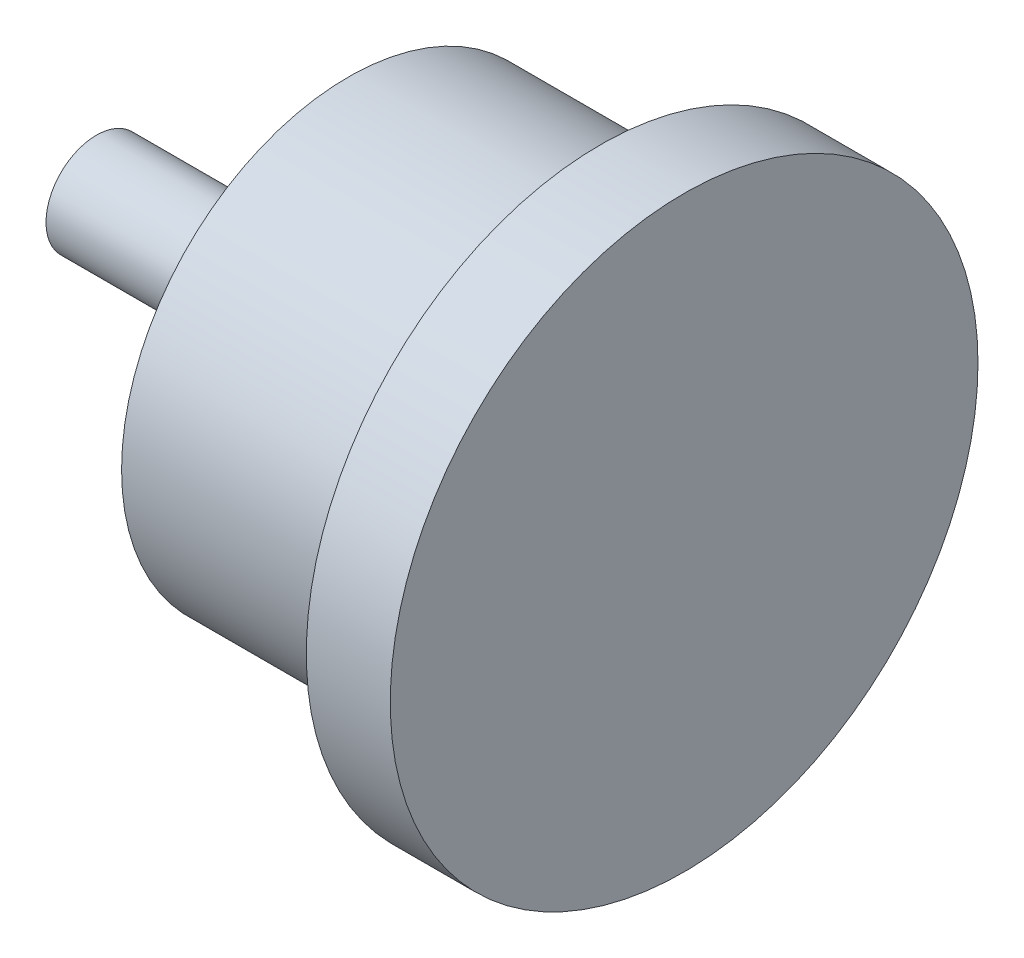
ISO-10303-21;
HEADER;
FILE_DESCRIPTION(('STEP AP214'),'2;1');
FILE_NAME('part.step','',(''),(''),'','','');
FILE_SCHEMA(('AUTOMOTIVE_DESIGN { 1 0 10303 214 1 1 1 1 }'));
ENDSEC;
DATA;
#1=APPLICATION_CONTEXT('core data for automotive mechanical design processes');
#2=APPLICATION_PROTOCOL_DEFINITION('international standard','automotive_design',2000,#1);
#3=PRODUCT_CONTEXT('',#1,'mechanical');
#4=PRODUCT('Part','Part','',(#3));
#5=PRODUCT_RELATED_PRODUCT_CATEGORY('part','',(#4));
#6=PRODUCT_DEFINITION_FORMATION('','',#4);
#7=PRODUCT_DEFINITION_CONTEXT('part definition',#1,'design');
#8=PRODUCT_DEFINITION('design','',#6,#7);
#9=PRODUCT_DEFINITION_SHAPE('','',#8);
#10=(LENGTH_UNIT() NAMED_UNIT(*) SI_UNIT(.MILLI.,.METRE.));
#11=(NAMED_UNIT(*) PLANE_ANGLE_UNIT() SI_UNIT($,.RADIAN.));
#12=(NAMED_UNIT(*) SI_UNIT($,.STERADIAN.) SOLID_ANGLE_UNIT());
#13=UNCERTAINTY_MEASURE_WITH_UNIT(LENGTH_MEASURE(1.E-05),#10,'distance_accuracy_value','');
#14=(GEOMETRIC_REPRESENTATION_CONTEXT(3) GLOBAL_UNCERTAINTY_ASSIGNED_CONTEXT((#13)) GLOBAL_UNIT_ASSIGNED_CONTEXT((#10,
#11,#12)) REPRESENTATION_CONTEXT('',''));
#15=CARTESIAN_POINT('',(0.,0.,0.));
#16=DIRECTION('',(0.,0.,1.));
#17=DIRECTION('',(1.,0.,0.));
#18=AXIS2_PLACEMENT_3D('',#15,#16,#17);
#19=CARTESIAN_POINT('',(5.,0.,0.));
#20=DIRECTION('',(-1.,0.,0.));
#21=DIRECTION('',(0.,0.,1.));
#22=AXIS2_PLACEMENT_3D('',#19,#20,#21);
#23=CYLINDRICAL_SURFACE('',#22,17.5);
#24=CARTESIAN_POINT('',(5.,0.,0.));
#25=DIRECTION('',(1.,0.,0.));
#26=DIRECTION('',(0.,0.,-1.));
#27=AXIS2_PLACEMENT_3D('',#24,#25,#26);
#28=CIRCLE('',#27,17.5);
#29=CARTESIAN_POINT('',(5.,0.,-17.5));
#30=VERTEX_POINT('',#29);
#31=EDGE_CURVE('E51',#30,#30,#28,.T.);
#32=ORIENTED_EDGE('',*,*,#31,.F.);
#33=EDGE_LOOP('',(#32));
#34=FACE_BOUND('',#33,.T.);
#35=CARTESIAN_POINT('',(0.,0.,0.));
#36=DIRECTION('',(1.,0.,0.));
#37=DIRECTION('',(0.,0.,-1.));
#38=AXIS2_PLACEMENT_3D('',#35,#36,#37);
#39=CIRCLE('',#38,17.5);
#40=CARTESIAN_POINT('',(0.,0.,-17.5));
#41=VERTEX_POINT('',#40);
#42=EDGE_CURVE('E40',#41,#41,#39,.T.);
#43=ORIENTED_EDGE('',*,*,#42,.T.);
#44=EDGE_LOOP('',(#43));
#45=FACE_BOUND('',#44,.T.);
#46=ADVANCED_FACE('F37',(#34,#45),#23,.T.);
#47=CARTESIAN_POINT('',(5.,0.,0.));
#48=DIRECTION('',(1.,0.,0.));
#49=DIRECTION('',(0.,0.,-1.));
#50=AXIS2_PLACEMENT_3D('',#47,#48,#49);
#51=PLANE('',#50);
#52=ORIENTED_EDGE('',*,*,#31,.T.);
#53=EDGE_LOOP('',(#52));
#54=FACE_BOUND('',#53,.T.);
#55=ADVANCED_FACE('F71',(#54),#51,.T.);
#56=CARTESIAN_POINT('',(0.,0.,0.));
#57=DIRECTION('',(1.,0.,0.));
#58=DIRECTION('',(0.,0.,-1.));
#59=AXIS2_PLACEMENT_3D('',#56,#57,#58);
#60=PLANE('',#59);
#61=CARTESIAN_POINT('',(0.,0.,0.));
#62=DIRECTION('',(-1.,0.,0.));
#63=DIRECTION('',(0.,0.,1.));
#64=AXIS2_PLACEMENT_3D('',#61,#62,#63);
#65=CIRCLE('',#64,13.5);
#66=CARTESIAN_POINT('',(0.,0.,13.5));
#67=VERTEX_POINT('',#66);
#68=EDGE_CURVE('E45',#67,#67,#65,.T.);
#69=ORIENTED_EDGE('',*,*,#68,.F.);
#70=EDGE_LOOP('',(#69));
#71=FACE_BOUND('',#70,.T.);
#72=ORIENTED_EDGE('',*,*,#42,.F.);
#73=EDGE_LOOP('',(#72));
#74=FACE_BOUND('',#73,.T.);
#75=ADVANCED_FACE('F68',(#71,#74),#60,.F.);
#76=CARTESIAN_POINT('',(-15.,0.,0.));
#77=DIRECTION('',(1.,0.,0.));
#78=DIRECTION('',(0.,0.,-1.));
#79=AXIS2_PLACEMENT_3D('',#76,#77,#78);
#80=CYLINDRICAL_SURFACE('',#79,13.5);
#81=CARTESIAN_POINT('',(-15.,0.,0.));
#82=DIRECTION('',(-1.,0.,0.));
#83=DIRECTION('',(0.,0.,1.));
#84=AXIS2_PLACEMENT_3D('',#81,#82,#83);
#85=CIRCLE('',#84,13.5);
#86=CARTESIAN_POINT('',(-15.,0.,13.5));
#87=VERTEX_POINT('',#86);
#88=EDGE_CURVE('E56',#87,#87,#85,.T.);
#89=ORIENTED_EDGE('',*,*,#88,.F.);
#90=EDGE_LOOP('',(#89));
#91=FACE_BOUND('',#90,.T.);
#92=ORIENTED_EDGE('',*,*,#68,.T.);
#93=EDGE_LOOP('',(#92));
#94=FACE_BOUND('',#93,.T.);
#95=ADVANCED_FACE('F70',(#91,#94),#80,.T.);
#96=CARTESIAN_POINT('',(-15.,0.,0.));
#97=DIRECTION('',(-1.,0.,0.));
#98=DIRECTION('',(0.,0.,1.));
#99=AXIS2_PLACEMENT_3D('',#96,#97,#98);
#100=PLANE('',#99);
#101=CARTESIAN_POINT('',(-15.,0.,0.));
#102=DIRECTION('',(-1.,0.,0.));
#103=DIRECTION('',(0.,0.,1.));
#104=AXIS2_PLACEMENT_3D('',#101,#102,#103);
#105=CIRCLE('',#104,3.);
#106=CARTESIAN_POINT('',(-15.,0.,3.));
#107=VERTEX_POINT('',#106);
#108=EDGE_CURVE('E10',#107,#107,#105,.T.);
#109=ORIENTED_EDGE('',*,*,#108,.F.);
#110=EDGE_LOOP('',(#109));
#111=FACE_BOUND('',#110,.T.);
#112=ORIENTED_EDGE('',*,*,#88,.T.);
#113=EDGE_LOOP('',(#112));
#114=FACE_BOUND('',#113,.T.);
#115=ADVANCED_FACE('F77',(#111,#114),#100,.T.);
#116=CARTESIAN_POINT('',(-30.,0.,0.));
#117=DIRECTION('',(1.,0.,0.));
#118=DIRECTION('',(0.,0.,-1.));
#119=AXIS2_PLACEMENT_3D('',#116,#117,#118);
#120=CYLINDRICAL_SURFACE('',#119,3.);
#121=CARTESIAN_POINT('',(-30.,0.,0.));
#122=DIRECTION('',(-1.,0.,0.));
#123=DIRECTION('',(0.,0.,1.));
#124=AXIS2_PLACEMENT_3D('',#121,#122,#123);
#125=CIRCLE('',#124,3.);
#126=CARTESIAN_POINT('',(-30.,0.,3.));
#127=VERTEX_POINT('',#126);
#128=EDGE_CURVE('E55',#127,#127,#125,.T.);
#129=ORIENTED_EDGE('',*,*,#128,.F.);
#130=EDGE_LOOP('',(#129));
#131=FACE_BOUND('',#130,.T.);
#132=ORIENTED_EDGE('',*,*,#108,.T.);
#133=EDGE_LOOP('',(#132));
#134=FACE_BOUND('',#133,.T.);
#135=ADVANCED_FACE('F109',(#131,#134),#120,.T.);
#136=CARTESIAN_POINT('',(-30.,0.,0.));
#137=DIRECTION('',(-1.,0.,0.));
#138=DIRECTION('',(0.,0.,1.));
#139=AXIS2_PLACEMENT_3D('',#136,#137,#138);
#140=PLANE('',#139);
#141=ORIENTED_EDGE('',*,*,#128,.T.);
#142=EDGE_LOOP('',(#141));
#143=FACE_BOUND('',#142,.T.);
#144=ADVANCED_FACE('F119',(#143),#140,.T.);
#145=CLOSED_SHELL('',(#46,#55,#75,#95,#115,#135,#144));
#146=MANIFOLD_SOLID_BREP('B2',#145);
#147=ADVANCED_BREP_SHAPE_REPRESENTATION('',(#18,#146),#14);
#148=SHAPE_DEFINITION_REPRESENTATION(#9,#147);
ENDSEC;
END-ISO-10303-21;
